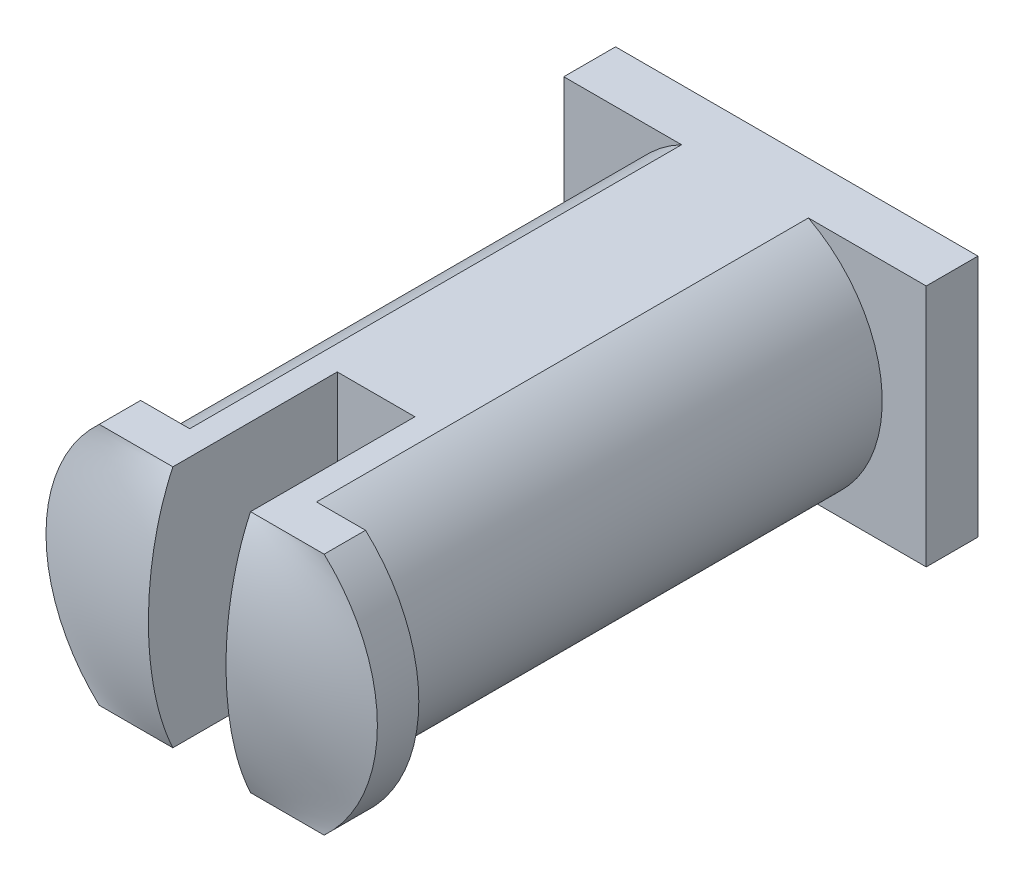
ISO-10303-21;
HEADER;
FILE_DESCRIPTION(('STEP AP214'),'2;1');
FILE_NAME('part.step','',(''),(''),'','','');
FILE_SCHEMA(('AUTOMOTIVE_DESIGN { 1 0 10303 214 1 1 1 1 }'));
ENDSEC;
DATA;
#1=APPLICATION_CONTEXT('core data for automotive mechanical design processes');
#2=APPLICATION_PROTOCOL_DEFINITION('international standard','automotive_design',2000,#1);
#3=PRODUCT_CONTEXT('',#1,'mechanical');
#4=PRODUCT('Part','Part','',(#3));
#5=PRODUCT_RELATED_PRODUCT_CATEGORY('part','',(#4));
#6=PRODUCT_DEFINITION_FORMATION('','',#4);
#7=PRODUCT_DEFINITION_CONTEXT('part definition',#1,'design');
#8=PRODUCT_DEFINITION('design','',#6,#7);
#9=PRODUCT_DEFINITION_SHAPE('','',#8);
#10=(LENGTH_UNIT() NAMED_UNIT(*) SI_UNIT(.MILLI.,.METRE.));
#11=(NAMED_UNIT(*) PLANE_ANGLE_UNIT() SI_UNIT($,.RADIAN.));
#12=(NAMED_UNIT(*) SI_UNIT($,.STERADIAN.) SOLID_ANGLE_UNIT());
#13=UNCERTAINTY_MEASURE_WITH_UNIT(LENGTH_MEASURE(1.E-05),#10,'distance_accuracy_value','');
#14=(GEOMETRIC_REPRESENTATION_CONTEXT(3) GLOBAL_UNCERTAINTY_ASSIGNED_CONTEXT((#13)) GLOBAL_UNIT_ASSIGNED_CONTEXT((#10,
#11,#12)) REPRESENTATION_CONTEXT('',''));
#15=CARTESIAN_POINT('',(0.,0.,0.));
#16=DIRECTION('',(0.,0.,1.));
#17=DIRECTION('',(1.,0.,0.));
#18=AXIS2_PLACEMENT_3D('',#15,#16,#17);
#19=CARTESIAN_POINT('',(-2.75841544187963,-2.9845,14.351));
#20=CARTESIAN_POINT('',(-0.919471813959878,-2.9845,14.351));
#21=CARTESIAN_POINT('',(0.919471813959876,-2.9845,14.351));
#22=CARTESIAN_POINT('',(2.75841544187963,-2.9845,14.351));
#23=CARTESIAN_POINT('',(-4.61780328789597,-1.2659661930324,14.351));
#24=CARTESIAN_POINT('',(-1.53926776263199,-1.2659661930324,15.5506106265129));
#25=CARTESIAN_POINT('',(1.53926776263199,-1.2659661930324,15.5506106265129));
#26=CARTESIAN_POINT('',(4.61780328789597,-1.2659661930324,14.351));
#27=CARTESIAN_POINT('',(-4.61780328789597,1.2659661930324,14.351));
#28=CARTESIAN_POINT('',(-1.53926776263199,1.2659661930324,15.5468752666751));
#29=CARTESIAN_POINT('',(1.53926776263199,1.2659661930324,15.5791275291301));
#30=CARTESIAN_POINT('',(4.61780328789597,1.2659661930324,14.351));
#31=CARTESIAN_POINT('',(-2.75841544187963,2.9845,14.351));
#32=CARTESIAN_POINT('',(-0.919471813959877,2.9845,14.351));
#33=CARTESIAN_POINT('',(0.919471813959877,2.9845,14.351));
#34=CARTESIAN_POINT('',(2.75841544187963,2.9845,14.351));
#35=(BOUNDED_SURFACE() B_SPLINE_SURFACE(3,3,((#19,#20,#21,#22),(#23,#24,#25,#26),(#27,#28,#29,
#30),(#31,#32,#33,#34)),.UNSPECIFIED.,.F.,.F.,.F.) B_SPLINE_SURFACE_WITH_KNOTS((4,4),(4,4),(0.,
1.),(0.,1.),.UNSPECIFIED.) GEOMETRIC_REPRESENTATION_ITEM() RATIONAL_B_SPLINE_SURFACE(((1.,1.,1.,
1.),(0.785829304770281,0.785829304770281,0.785829304770281,0.785829304770281),
(0.785829304770281,0.785829304770281,0.785829304770281,0.785829304770281),(1.,1.,1.,1.))) REPRESENTATION_ITEM('') SURFACE());
#36=DIRECTION('',(-1.,0.,0.));
#37=VECTOR('',#36,1.);
#38=CARTESIAN_POINT('',(-2.75841544187963,2.9845,14.351));
#39=LINE('',#38,#37);
#40=CARTESIAN_POINT('',(2.75841544187963,2.9845,14.351));
#41=VERTEX_POINT('',#40);
#42=CARTESIAN_POINT('',(0.9525,2.9845,14.351));
#43=VERTEX_POINT('',#42);
#44=EDGE_CURVE('E214',#41,#43,#39,.T.);
#45=CARTESIAN_POINT('',(0.9525,2.9845,14.351));
#46=CARTESIAN_POINT('',(0.9525,2.89639679395536,14.3922859415164));
#47=CARTESIAN_POINT('',(0.9525,2.80716008680234,14.4311139963097));
#48=CARTESIAN_POINT('',(0.9525,2.62690922869744,14.5039666566708));
#49=CARTESIAN_POINT('',(0.9525,2.53589812612907,14.5379987939517));
#50=CARTESIAN_POINT('',(0.9525,2.3523476412508,14.6014875861348));
#51=CARTESIAN_POINT('',(0.9525,2.2598089717893,14.6309463119983));
#52=CARTESIAN_POINT('',(0.9525,2.0732753749713,14.6856401946687));
#53=CARTESIAN_POINT('',(0.9525,1.97927768762511,14.7108658999848));
#54=CARTESIAN_POINT('',(0.9525,1.79024766304031,14.7572672013593));
#55=CARTESIAN_POINT('',(0.9525,1.69521489086051,14.7784410194967));
#56=CARTESIAN_POINT('',(0.9525,1.50435017689916,14.8169411729562));
#57=CARTESIAN_POINT('',(0.9525,1.40851800944559,14.8342663808417));
#58=CARTESIAN_POINT('',(0.952499999999999,1.15923089187968,14.8744254970377));
#59=CARTESIAN_POINT('',(0.9525,1.00531402271061,14.8944312291501));
#60=CARTESIAN_POINT('',(0.9525,0.696571738446862,14.9256146616373));
#61=CARTESIAN_POINT('',(0.9525,0.541746127972846,14.9367903878654));
#62=CARTESIAN_POINT('',(0.9525,0.23166990327333,14.9505928887469));
#63=CARTESIAN_POINT('',(0.9525,0.0764191774055433,14.9532171471547));
#64=CARTESIAN_POINT('',(0.9525,-0.233974941819646,14.949993518927));
#65=CARTESIAN_POINT('',(0.952499999999999,-0.389118346128311,14.9441466863906));
#66=CARTESIAN_POINT('',(0.952500000000001,-0.698801928554943,14.9238748420902));
#67=CARTESIAN_POINT('',(0.952500000000003,-0.85334226846948,14.9094523169607));
#68=CARTESIAN_POINT('',(0.952499999999997,-1.16129619955811,14.8717241962405));
#69=CARTESIAN_POINT('',(0.952499999999988,-1.31471015115525,14.8484215807522));
#70=CARTESIAN_POINT('',(0.952499999999989,-1.59791469544487,14.7964221225476));
#71=CARTESIAN_POINT('',(0.952499999999997,-1.72793575202501,14.7689794117324));
#72=CARTESIAN_POINT('',(0.952500000000003,-1.98619255256503,14.7067140464462));
#73=CARTESIAN_POINT('',(0.952500000000001,-2.11442866894973,14.6718929568263));
#74=CARTESIAN_POINT('',(0.9525,-2.32591473498404,14.607294144606));
#75=CARTESIAN_POINT('',(0.9525,-2.40984585068346,14.5797337533182));
#76=CARTESIAN_POINT('',(0.9525,-2.57643570532112,14.5208933616152));
#77=CARTESIAN_POINT('',(0.9525,-2.65909396325007,14.4896119922114));
#78=CARTESIAN_POINT('',(0.9525,-2.82296684993933,14.4232071818526));
#79=CARTESIAN_POINT('',(0.952499999999999,-2.90417962228176,14.3880791639081));
#80=CARTESIAN_POINT('',(0.952499999999998,-2.9845,14.351));
#81=B_SPLINE_CURVE_WITH_KNOTS('',3,(#45,#46,#47,#48,#49,#50,#51,#52,#53,#54,#55,#56,#57,#58,#59,
#60,#61,#62,#63,#64,#65,#66,#67,#68,#69,#70,#71,#72,#73,#74,#75,#76,#77,#78,#79,#80),
.UNSPECIFIED.,.F.,.F.,(4,2,2,2,2,2,2,2,2,2,2,2,2,2,2,2,2,4),(0.,0.29182945372805,
0.583195373160211,0.874428967151296,1.16630441626286,1.4583076447358,1.75039630204355,
2.21574098255921,2.68118967194621,3.1467753059626,3.61230300987704,4.07769579371437,
4.54293253200652,4.94139982741323,5.33978269791094,5.60472773292016,5.8697705473642,
6.13513222577563),.UNSPECIFIED.);
#82=CARTESIAN_POINT('',(0.9525,-2.9845,14.351));
#83=VERTEX_POINT('',#82);
#84=EDGE_CURVE('E11',#43,#83,#81,.T.);
#85=DIRECTION('',(1.,0.,0.));
#86=VECTOR('',#85,1.);
#87=CARTESIAN_POINT('',(-2.75841544187963,-2.9845,14.351));
#88=LINE('',#87,#86);
#89=CARTESIAN_POINT('',(2.75841544187963,-2.9845,14.351));
#90=VERTEX_POINT('',#89);
#91=EDGE_CURVE('E212',#83,#90,#88,.T.);
#92=CARTESIAN_POINT('',(0.,0.,14.351));
#93=DIRECTION('',(0.,0.,1.));
#94=DIRECTION('',(-1.,0.,0.));
#95=AXIS2_PLACEMENT_3D('',#92,#93,#94);
#96=CIRCLE('',#95,4.064);
#97=EDGE_CURVE('E219',#90,#41,#96,.T.);
#98=ORIENTED_EDGE('',*,*,#44,.T.);
#99=ORIENTED_EDGE('',*,*,#84,.T.);
#100=ORIENTED_EDGE('',*,*,#91,.T.);
#101=ORIENTED_EDGE('',*,*,#97,.T.);
#102=EDGE_LOOP('',(#98,#99,#100,#101));
#103=FACE_BOUND('',#102,.T.);
#104=ADVANCED_FACE('F38',(#103),#35,.F.);
#105=CARTESIAN_POINT('',(0.,0.,1.27));
#106=DIRECTION('',(0.,0.,1.));
#107=DIRECTION('',(1.,0.,0.));
#108=AXIS2_PLACEMENT_3D('',#105,#106,#107);
#109=PLANE('',#108);
#110=CARTESIAN_POINT('',(0.,0.,1.27));
#111=DIRECTION('',(0.,0.,1.));
#112=DIRECTION('',(1.,0.,0.));
#113=AXIS2_PLACEMENT_3D('',#110,#111,#112);
#114=CIRCLE('',#113,3.3655);
#115=CARTESIAN_POINT('',(-1.55542598666732,2.9845,1.27));
#116=VERTEX_POINT('',#115);
#117=CARTESIAN_POINT('',(-1.55542598666732,-2.9845,1.27));
#118=VERTEX_POINT('',#117);
#119=EDGE_CURVE('E146',#116,#118,#114,.T.);
#120=ORIENTED_EDGE('',*,*,#119,.F.);
#121=DIRECTION('',(-1.,0.,0.));
#122=VECTOR('',#121,1.);
#123=CARTESIAN_POINT('',(-4.445,2.9845,1.27));
#124=LINE('',#123,#122);
#125=CARTESIAN_POINT('',(-4.445,2.9845,1.27));
#126=VERTEX_POINT('',#125);
#127=EDGE_CURVE('E149',#116,#126,#124,.T.);
#128=ORIENTED_EDGE('',*,*,#127,.T.);
#129=DIRECTION('',(0.,-1.,0.));
#130=VECTOR('',#129,1.);
#131=CARTESIAN_POINT('',(-4.445,2.9845,1.27));
#132=LINE('',#131,#130);
#133=CARTESIAN_POINT('',(-4.445,-2.9845,1.27));
#134=VERTEX_POINT('',#133);
#135=EDGE_CURVE('E189',#126,#134,#132,.T.);
#136=ORIENTED_EDGE('',*,*,#135,.T.);
#137=DIRECTION('',(1.,0.,0.));
#138=VECTOR('',#137,1.);
#139=CARTESIAN_POINT('',(-4.445,-2.9845,1.27));
#140=LINE('',#139,#138);
#141=EDGE_CURVE('E152',#134,#118,#140,.T.);
#142=ORIENTED_EDGE('',*,*,#141,.T.);
#143=EDGE_LOOP('',(#120,#128,#136,#142));
#144=FACE_BOUND('',#143,.T.);
#145=ADVANCED_FACE('F148',(#144),#109,.T.);
#146=CARTESIAN_POINT('',(4.445,2.9845,1.27));
#147=DIRECTION('',(-1.,0.,0.));
#148=DIRECTION('',(0.,0.,1.));
#149=AXIS2_PLACEMENT_3D('',#146,#147,#148);
#150=PLANE('',#149);
#151=DIRECTION('',(0.,1.,0.));
#152=VECTOR('',#151,1.);
#153=CARTESIAN_POINT('',(4.445,2.9845,0.));
#154=LINE('',#153,#152);
#155=CARTESIAN_POINT('',(4.445,-2.9845,0.));
#156=VERTEX_POINT('',#155);
#157=CARTESIAN_POINT('',(4.445,2.9845,0.));
#158=VERTEX_POINT('',#157);
#159=EDGE_CURVE('E185',#156,#158,#154,.T.);
#160=ORIENTED_EDGE('',*,*,#159,.T.);
#161=DIRECTION('',(0.,0.,-1.));
#162=VECTOR('',#161,1.);
#163=CARTESIAN_POINT('',(4.445,2.9845,1.27));
#164=LINE('',#163,#162);
#165=CARTESIAN_POINT('',(4.445,2.9845,1.27));
#166=VERTEX_POINT('',#165);
#167=EDGE_CURVE('E207',#166,#158,#164,.T.);
#168=ORIENTED_EDGE('',*,*,#167,.F.);
#169=DIRECTION('',(0.,1.,0.));
#170=VECTOR('',#169,1.);
#171=CARTESIAN_POINT('',(4.445,2.9845,1.27));
#172=LINE('',#171,#170);
#173=CARTESIAN_POINT('',(4.445,-2.9845,1.27));
#174=VERTEX_POINT('',#173);
#175=EDGE_CURVE('E166',#174,#166,#172,.T.);
#176=ORIENTED_EDGE('',*,*,#175,.F.);
#177=DIRECTION('',(0.,0.,-1.));
#178=VECTOR('',#177,1.);
#179=CARTESIAN_POINT('',(4.445,-2.9845,1.27));
#180=LINE('',#179,#178);
#181=EDGE_CURVE('E193',#174,#156,#180,.T.);
#182=ORIENTED_EDGE('',*,*,#181,.T.);
#183=EDGE_LOOP('',(#160,#168,#176,#182));
#184=FACE_BOUND('',#183,.T.);
#185=ADVANCED_FACE('F272',(#184),#150,.F.);
#186=CARTESIAN_POINT('',(-4.445,2.9845,1.27));
#187=DIRECTION('',(0.,-1.,0.));
#188=DIRECTION('',(0.,0.,-1.));
#189=AXIS2_PLACEMENT_3D('',#186,#187,#188);
#190=PLANE('',#189);
#191=DIRECTION('',(-1.,0.,0.));
#192=VECTOR('',#191,1.);
#193=CARTESIAN_POINT('',(-0.9525,2.9845,10.31875));
#194=LINE('',#193,#192);
#195=CARTESIAN_POINT('',(0.9525,2.9845,10.31875));
#196=VERTEX_POINT('',#195);
#197=CARTESIAN_POINT('',(-0.9525,2.9845,10.31875));
#198=VERTEX_POINT('',#197);
#199=EDGE_CURVE('E350',#196,#198,#194,.T.);
#200=ORIENTED_EDGE('',*,*,#199,.F.);
#201=DIRECTION('',(0.,0.,-1.));
#202=VECTOR('',#201,1.);
#203=CARTESIAN_POINT('',(0.9525,2.9845,10.31875));
#204=LINE('',#203,#202);
#205=EDGE_CURVE('E335',#43,#196,#204,.T.);
#206=ORIENTED_EDGE('',*,*,#205,.F.);
#207=ORIENTED_EDGE('',*,*,#44,.F.);
#208=DIRECTION('',(0.,0.,-1.));
#209=VECTOR('',#208,1.);
#210=CARTESIAN_POINT('',(2.75841544187963,2.9845,14.351));
#211=LINE('',#210,#209);
#212=CARTESIAN_POINT('',(2.75841544187963,2.9845,13.335));
#213=VERTEX_POINT('',#212);
#214=EDGE_CURVE('E319',#41,#213,#211,.T.);
#215=ORIENTED_EDGE('',*,*,#214,.T.);
#216=DIRECTION('',(-1.,0.,0.));
#217=VECTOR('',#216,1.);
#218=CARTESIAN_POINT('',(-2.75841544187963,2.9845,13.335));
#219=LINE('',#218,#217);
#220=CARTESIAN_POINT('',(1.55542598666732,2.9845,13.335));
#221=VERTEX_POINT('',#220);
#222=EDGE_CURVE('E213',#213,#221,#219,.T.);
#223=ORIENTED_EDGE('',*,*,#222,.T.);
#224=DIRECTION('',(0.,0.,-1.));
#225=VECTOR('',#224,1.);
#226=CARTESIAN_POINT('',(1.55542598666732,2.9845,13.335));
#227=LINE('',#226,#225);
#228=CARTESIAN_POINT('',(1.55542598666732,2.9845,1.27));
#229=VERTEX_POINT('',#228);
#230=EDGE_CURVE('E171',#221,#229,#227,.T.);
#231=ORIENTED_EDGE('',*,*,#230,.T.);
#232=EDGE_CURVE('E165',#166,#229,#124,.T.);
#233=ORIENTED_EDGE('',*,*,#232,.F.);
#234=ORIENTED_EDGE('',*,*,#167,.T.);
#235=DIRECTION('',(-1.,0.,0.));
#236=VECTOR('',#235,1.);
#237=CARTESIAN_POINT('',(-4.445,2.9845,0.));
#238=LINE('',#237,#236);
#239=CARTESIAN_POINT('',(-4.445,2.9845,0.));
#240=VERTEX_POINT('',#239);
#241=EDGE_CURVE('E196',#158,#240,#238,.T.);
#242=ORIENTED_EDGE('',*,*,#241,.T.);
#243=DIRECTION('',(0.,0.,-1.));
#244=VECTOR('',#243,1.);
#245=CARTESIAN_POINT('',(-4.445,2.9845,1.27));
#246=LINE('',#245,#244);
#247=EDGE_CURVE('E163',#126,#240,#246,.T.);
#248=ORIENTED_EDGE('',*,*,#247,.F.);
#249=ORIENTED_EDGE('',*,*,#127,.F.);
#250=DIRECTION('',(0.,0.,-1.));
#251=VECTOR('',#250,1.);
#252=CARTESIAN_POINT('',(-1.55542598666732,2.9845,13.335));
#253=LINE('',#252,#251);
#254=CARTESIAN_POINT('',(-1.55542598666732,2.9845,13.335));
#255=VERTEX_POINT('',#254);
#256=EDGE_CURVE('E160',#255,#116,#253,.T.);
#257=ORIENTED_EDGE('',*,*,#256,.F.);
#258=CARTESIAN_POINT('',(-2.75841544187963,2.9845,13.335));
#259=VERTEX_POINT('',#258);
#260=EDGE_CURVE('E102',#255,#259,#219,.T.);
#261=ORIENTED_EDGE('',*,*,#260,.T.);
#262=DIRECTION('',(0.,0.,-1.));
#263=VECTOR('',#262,1.);
#264=CARTESIAN_POINT('',(-2.75841544187963,2.9845,14.351));
#265=LINE('',#264,#263);
#266=CARTESIAN_POINT('',(-2.75841544187963,2.9845,14.351));
#267=VERTEX_POINT('',#266);
#268=EDGE_CURVE('E217',#267,#259,#265,.T.);
#269=ORIENTED_EDGE('',*,*,#268,.F.);
#270=CARTESIAN_POINT('',(-0.952499999999999,2.9845,14.351));
#271=VERTEX_POINT('',#270);
#272=EDGE_CURVE('E218',#271,#267,#39,.T.);
#273=ORIENTED_EDGE('',*,*,#272,.F.);
#274=DIRECTION('',(0.,0.,1.));
#275=VECTOR('',#274,1.);
#276=CARTESIAN_POINT('',(-0.9525,2.9845,10.31875));
#277=LINE('',#276,#275);
#278=EDGE_CURVE('E61',#198,#271,#277,.T.);
#279=ORIENTED_EDGE('',*,*,#278,.F.);
#280=EDGE_LOOP('',(#200,#206,#207,#215,#223,#231,#233,#234,#242,#248,#249,#257,#261,#269,#273,#279));
#281=FACE_BOUND('',#280,.T.);
#282=ADVANCED_FACE('F159',(#281),#190,.F.);
#283=CARTESIAN_POINT('',(-4.445,2.9845,1.27));
#284=DIRECTION('',(1.,0.,0.));
#285=DIRECTION('',(0.,0.,-1.));
#286=AXIS2_PLACEMENT_3D('',#283,#284,#285);
#287=PLANE('',#286);
#288=DIRECTION('',(0.,-1.,0.));
#289=VECTOR('',#288,1.);
#290=CARTESIAN_POINT('',(-4.445,2.9845,0.));
#291=LINE('',#290,#289);
#292=CARTESIAN_POINT('',(-4.445,-2.9845,0.));
#293=VERTEX_POINT('',#292);
#294=EDGE_CURVE('E198',#240,#293,#291,.T.);
#295=ORIENTED_EDGE('',*,*,#294,.T.);
#296=DIRECTION('',(0.,0.,-1.));
#297=VECTOR('',#296,1.);
#298=CARTESIAN_POINT('',(-4.445,-2.9845,1.27));
#299=LINE('',#298,#297);
#300=EDGE_CURVE('E203',#134,#293,#299,.T.);
#301=ORIENTED_EDGE('',*,*,#300,.F.);
#302=ORIENTED_EDGE('',*,*,#135,.F.);
#303=ORIENTED_EDGE('',*,*,#247,.T.);
#304=EDGE_LOOP('',(#295,#301,#302,#303));
#305=FACE_BOUND('',#304,.T.);
#306=ADVANCED_FACE('F267',(#305),#287,.F.);
#307=CARTESIAN_POINT('',(-4.445,-2.9845,1.27));
#308=DIRECTION('',(0.,1.,0.));
#309=DIRECTION('',(0.,0.,1.));
#310=AXIS2_PLACEMENT_3D('',#307,#308,#309);
#311=PLANE('',#310);
#312=ORIENTED_EDGE('',*,*,#91,.F.);
#313=DIRECTION('',(0.,0.,1.));
#314=VECTOR('',#313,1.);
#315=CARTESIAN_POINT('',(0.9525,-2.9845,10.31875));
#316=LINE('',#315,#314);
#317=CARTESIAN_POINT('',(0.9525,-2.9845,10.31875));
#318=VERTEX_POINT('',#317);
#319=EDGE_CURVE('E338',#318,#83,#316,.T.);
#320=ORIENTED_EDGE('',*,*,#319,.F.);
#321=DIRECTION('',(1.,0.,0.));
#322=VECTOR('',#321,1.);
#323=CARTESIAN_POINT('',(-0.9525,-2.9845,10.31875));
#324=LINE('',#323,#322);
#325=CARTESIAN_POINT('',(-0.9525,-2.9845,10.31875));
#326=VERTEX_POINT('',#325);
#327=EDGE_CURVE('E341',#326,#318,#324,.T.);
#328=ORIENTED_EDGE('',*,*,#327,.F.);
#329=DIRECTION('',(0.,0.,-1.));
#330=VECTOR('',#329,1.);
#331=CARTESIAN_POINT('',(-0.9525,-2.9845,10.31875));
#332=LINE('',#331,#330);
#333=CARTESIAN_POINT('',(-0.9525,-2.9845,14.351));
#334=VERTEX_POINT('',#333);
#335=EDGE_CURVE('E343',#334,#326,#332,.T.);
#336=ORIENTED_EDGE('',*,*,#335,.F.);
#337=CARTESIAN_POINT('',(-2.75841544187963,-2.9845,14.351));
#338=VERTEX_POINT('',#337);
#339=EDGE_CURVE('E93',#338,#334,#88,.T.);
#340=ORIENTED_EDGE('',*,*,#339,.F.);
#341=DIRECTION('',(0.,0.,-1.));
#342=VECTOR('',#341,1.);
#343=CARTESIAN_POINT('',(-2.75841544187963,-2.9845,14.351));
#344=LINE('',#343,#342);
#345=CARTESIAN_POINT('',(-2.75841544187963,-2.9845,13.335));
#346=VERTEX_POINT('',#345);
#347=EDGE_CURVE('E156',#338,#346,#344,.T.);
#348=ORIENTED_EDGE('',*,*,#347,.T.);
#349=DIRECTION('',(1.,0.,0.));
#350=VECTOR('',#349,1.);
#351=CARTESIAN_POINT('',(-2.75841544187963,-2.9845,13.335));
#352=LINE('',#351,#350);
#353=CARTESIAN_POINT('',(-1.55542598666732,-2.9845,13.335));
#354=VERTEX_POINT('',#353);
#355=EDGE_CURVE('E313',#346,#354,#352,.T.);
#356=ORIENTED_EDGE('',*,*,#355,.T.);
#357=DIRECTION('',(0.,0.,-1.));
#358=VECTOR('',#357,1.);
#359=CARTESIAN_POINT('',(-1.55542598666732,-2.9845,13.335));
#360=LINE('',#359,#358);
#361=EDGE_CURVE('E183',#354,#118,#360,.T.);
#362=ORIENTED_EDGE('',*,*,#361,.T.);
#363=ORIENTED_EDGE('',*,*,#141,.F.);
#364=ORIENTED_EDGE('',*,*,#300,.T.);
#365=DIRECTION('',(1.,0.,0.));
#366=VECTOR('',#365,1.);
#367=CARTESIAN_POINT('',(-4.445,-2.9845,0.));
#368=LINE('',#367,#366);
#369=EDGE_CURVE('E187',#293,#156,#368,.T.);
#370=ORIENTED_EDGE('',*,*,#369,.T.);
#371=ORIENTED_EDGE('',*,*,#181,.F.);
#372=CARTESIAN_POINT('',(1.55542598666732,-2.9845,1.27));
#373=VERTEX_POINT('',#372);
#374=EDGE_CURVE('E191',#373,#174,#140,.T.);
#375=ORIENTED_EDGE('',*,*,#374,.F.);
#376=DIRECTION('',(0.,0.,-1.));
#377=VECTOR('',#376,1.);
#378=CARTESIAN_POINT('',(1.55542598666732,-2.9845,13.335));
#379=LINE('',#378,#377);
#380=CARTESIAN_POINT('',(1.55542598666732,-2.9845,13.335));
#381=VERTEX_POINT('',#380);
#382=EDGE_CURVE('E175',#381,#373,#379,.T.);
#383=ORIENTED_EDGE('',*,*,#382,.F.);
#384=CARTESIAN_POINT('',(2.75841544187963,-2.9845,13.335));
#385=VERTEX_POINT('',#384);
#386=EDGE_CURVE('E306',#381,#385,#352,.T.);
#387=ORIENTED_EDGE('',*,*,#386,.T.);
#388=DIRECTION('',(0.,0.,-1.));
#389=VECTOR('',#388,1.);
#390=CARTESIAN_POINT('',(2.75841544187963,-2.9845,14.351));
#391=LINE('',#390,#389);
#392=EDGE_CURVE('E309',#90,#385,#391,.T.);
#393=ORIENTED_EDGE('',*,*,#392,.F.);
#394=EDGE_LOOP('',(#312,#320,#328,#336,#340,#348,#356,#362,#363,#364,#370,#371,#375,#383,#387,#393));
#395=FACE_BOUND('',#394,.T.);
#396=ADVANCED_FACE('F261',(#395),#311,.F.);
#397=CARTESIAN_POINT('',(0.,0.,1.27));
#398=DIRECTION('',(0.,0.,1.));
#399=DIRECTION('',(1.,0.,0.));
#400=AXIS2_PLACEMENT_3D('',#397,#398,#399);
#401=CIRCLE('',#400,3.3655);
#402=EDGE_CURVE('E70',#373,#229,#401,.T.);
#403=ORIENTED_EDGE('',*,*,#402,.F.);
#404=ORIENTED_EDGE('',*,*,#374,.T.);
#405=ORIENTED_EDGE('',*,*,#175,.T.);
#406=ORIENTED_EDGE('',*,*,#232,.T.);
#407=EDGE_LOOP('',(#403,#404,#405,#406));
#408=FACE_BOUND('',#407,.T.);
#409=ADVANCED_FACE('F258',(#408),#109,.T.);
#410=CARTESIAN_POINT('',(0.,0.,0.));
#411=DIRECTION('',(0.,0.,1.));
#412=DIRECTION('',(1.,0.,0.));
#413=AXIS2_PLACEMENT_3D('',#410,#411,#412);
#414=PLANE('',#413);
#415=ORIENTED_EDGE('',*,*,#159,.F.);
#416=ORIENTED_EDGE('',*,*,#369,.F.);
#417=ORIENTED_EDGE('',*,*,#294,.F.);
#418=ORIENTED_EDGE('',*,*,#241,.F.);
#419=EDGE_LOOP('',(#415,#416,#417,#418));
#420=FACE_BOUND('',#419,.T.);
#421=ADVANCED_FACE('F257',(#420),#414,.F.);
#422=CARTESIAN_POINT('',(0.,0.,13.335));
#423=DIRECTION('',(0.,0.,-1.));
#424=DIRECTION('',(-1.,0.,0.));
#425=AXIS2_PLACEMENT_3D('',#422,#423,#424);
#426=CYLINDRICAL_SURFACE('',#425,3.3655);
#427=ORIENTED_EDGE('',*,*,#119,.T.);
#428=ORIENTED_EDGE('',*,*,#361,.F.);
#429=CARTESIAN_POINT('',(0.,0.,13.335));
#430=DIRECTION('',(0.,0.,1.));
#431=DIRECTION('',(1.,0.,0.));
#432=AXIS2_PLACEMENT_3D('',#429,#430,#431);
#433=CIRCLE('',#432,3.3655);
#434=EDGE_CURVE('E170',#255,#354,#433,.T.);
#435=ORIENTED_EDGE('',*,*,#434,.F.);
#436=ORIENTED_EDGE('',*,*,#256,.T.);
#437=EDGE_LOOP('',(#427,#428,#435,#436));
#438=FACE_BOUND('',#437,.T.);
#439=ADVANCED_FACE('F168',(#438),#426,.T.);
#440=CARTESIAN_POINT('',(0.,0.,13.335));
#441=DIRECTION('',(0.,0.,-1.));
#442=DIRECTION('',(-1.,0.,0.));
#443=AXIS2_PLACEMENT_3D('',#440,#441,#442);
#444=CYLINDRICAL_SURFACE('',#443,3.3655);
#445=ORIENTED_EDGE('',*,*,#402,.T.);
#446=ORIENTED_EDGE('',*,*,#230,.F.);
#447=CARTESIAN_POINT('',(0.,0.,13.335));
#448=DIRECTION('',(0.,0.,1.));
#449=DIRECTION('',(1.,0.,0.));
#450=AXIS2_PLACEMENT_3D('',#447,#448,#449);
#451=CIRCLE('',#450,3.3655);
#452=EDGE_CURVE('E172',#381,#221,#451,.T.);
#453=ORIENTED_EDGE('',*,*,#452,.F.);
#454=ORIENTED_EDGE('',*,*,#382,.T.);
#455=EDGE_LOOP('',(#445,#446,#453,#454));
#456=FACE_BOUND('',#455,.T.);
#457=ADVANCED_FACE('F251',(#456),#444,.T.);
#458=CARTESIAN_POINT('',(0.,0.,13.335));
#459=DIRECTION('',(0.,0.,-1.));
#460=DIRECTION('',(-1.,0.,0.));
#461=AXIS2_PLACEMENT_3D('',#458,#459,#460);
#462=PLANE('',#461);
#463=ORIENTED_EDGE('',*,*,#260,.F.);
#464=ORIENTED_EDGE('',*,*,#434,.T.);
#465=ORIENTED_EDGE('',*,*,#355,.F.);
#466=CARTESIAN_POINT('',(0.,0.,13.335));
#467=DIRECTION('',(0.,0.,1.));
#468=DIRECTION('',(-1.,0.,0.));
#469=AXIS2_PLACEMENT_3D('',#466,#467,#468);
#470=CIRCLE('',#469,4.064);
#471=EDGE_CURVE('E314',#259,#346,#470,.T.);
#472=ORIENTED_EDGE('',*,*,#471,.F.);
#473=EDGE_LOOP('',(#463,#464,#465,#472));
#474=FACE_BOUND('',#473,.T.);
#475=ADVANCED_FACE('F242',(#474),#462,.T.);
#476=CARTESIAN_POINT('',(0.,0.,14.351));
#477=DIRECTION('',(0.,0.,-1.));
#478=DIRECTION('',(-1.,0.,0.));
#479=AXIS2_PLACEMENT_3D('',#476,#477,#478);
#480=CYLINDRICAL_SURFACE('',#479,4.064);
#481=ORIENTED_EDGE('',*,*,#471,.T.);
#482=ORIENTED_EDGE('',*,*,#347,.F.);
#483=CARTESIAN_POINT('',(0.,0.,14.351));
#484=DIRECTION('',(0.,0.,1.));
#485=DIRECTION('',(-1.,0.,0.));
#486=AXIS2_PLACEMENT_3D('',#483,#484,#485);
#487=CIRCLE('',#486,4.064);
#488=EDGE_CURVE('E210',#267,#338,#487,.T.);
#489=ORIENTED_EDGE('',*,*,#488,.F.);
#490=ORIENTED_EDGE('',*,*,#268,.T.);
#491=EDGE_LOOP('',(#481,#482,#489,#490));
#492=FACE_BOUND('',#491,.T.);
#493=ADVANCED_FACE('F246',(#492),#480,.T.);
#494=CARTESIAN_POINT('',(0.,0.,14.351));
#495=DIRECTION('',(0.,0.,-1.));
#496=DIRECTION('',(-1.,0.,0.));
#497=AXIS2_PLACEMENT_3D('',#494,#495,#496);
#498=CYLINDRICAL_SURFACE('',#497,4.064);
#499=CARTESIAN_POINT('',(0.,0.,13.335));
#500=DIRECTION('',(0.,0.,1.));
#501=DIRECTION('',(-1.,0.,0.));
#502=AXIS2_PLACEMENT_3D('',#499,#500,#501);
#503=CIRCLE('',#502,4.064);
#504=EDGE_CURVE('E317',#385,#213,#503,.T.);
#505=ORIENTED_EDGE('',*,*,#504,.T.);
#506=ORIENTED_EDGE('',*,*,#214,.F.);
#507=ORIENTED_EDGE('',*,*,#97,.F.);
#508=ORIENTED_EDGE('',*,*,#392,.T.);
#509=EDGE_LOOP('',(#505,#506,#507,#508));
#510=FACE_BOUND('',#509,.T.);
#511=ADVANCED_FACE('F243',(#510),#498,.T.);
#512=CARTESIAN_POINT('',(-0.9525,-2.9845,14.351));
#513=CARTESIAN_POINT('',(-0.9525,-2.89457865187292,14.3925199830118));
#514=CARTESIAN_POINT('',(-0.9525,-2.80353088462356,14.4315626089535));
#515=CARTESIAN_POINT('',(-0.9525,-2.61966491151637,14.5048013430267));
#516=CARTESIAN_POINT('',(-0.9525,-2.52684961860236,14.5390047542583));
#517=CARTESIAN_POINT('',(-0.9525,-2.33969537427707,14.6027850129935));
#518=CARTESIAN_POINT('',(-0.9525,-2.24535710540702,14.6323638728451));
#519=CARTESIAN_POINT('',(-0.9525,-2.05514155498668,14.6872695466352));
#520=CARTESIAN_POINT('',(-0.9525,-1.95926042960282,14.7125829901317));
#521=CARTESIAN_POINT('',(-0.9525,-1.76646586029005,14.7590960455252));
#522=CARTESIAN_POINT('',(-0.9525,-1.66955199689774,14.7802939129656));
#523=CARTESIAN_POINT('',(-0.9525,-1.47492729342095,14.8187742451312));
#524=CARTESIAN_POINT('',(-0.952499999999999,-1.37721623471474,14.8360555956586));
#525=CARTESIAN_POINT('',(-0.952499999999999,-1.12514340849552,14.8756775259948));
#526=CARTESIAN_POINT('',(-0.9525,-0.970341875144311,14.8952591525857));
#527=CARTESIAN_POINT('',(-0.9525,-0.659860726674006,14.9256087962077));
#528=CARTESIAN_POINT('',(-0.9525,-0.504180932329514,14.9363749435535));
#529=CARTESIAN_POINT('',(-0.9525,-0.19241613528964,14.9493249302331));
#530=CARTESIAN_POINT('',(-0.9525,-0.0363310220514419,14.9515061111031));
#531=CARTESIAN_POINT('',(-0.9525,0.275600983456696,14.9473158902372));
#532=CARTESIAN_POINT('',(-0.952499999999999,0.431447966593401,14.9409511281567));
#533=CARTESIAN_POINT('',(-0.952500000000001,0.742511699341223,14.9195202975997));
#534=CARTESIAN_POINT('',(-0.952500000000003,0.897728623123027,14.9044568259331));
#535=CARTESIAN_POINT('',(-0.952499999999996,1.20692700420448,14.8652721482652));
#536=CARTESIAN_POINT('',(-0.952499999999987,1.36090891256467,14.841154418829));
#537=CARTESIAN_POINT('',(-0.952499999999981,1.76721364295355,14.7643420814864));
#538=CARTESIAN_POINT('',(-0.952499999999997,2.0180919088999,14.7032708428757));
#539=CARTESIAN_POINT('',(-0.952500000000001,2.34602935633918,14.6016797928753));
#540=CARTESIAN_POINT('',(-0.9525,2.42738889131763,14.5746311883608));
#541=CARTESIAN_POINT('',(-0.9525,2.58888100288673,14.5169680268545));
#542=CARTESIAN_POINT('',(-0.9525,2.66901311918022,14.486352167433));
#543=CARTESIAN_POINT('',(-0.9525,2.82788457829611,14.421447209968));
#544=CARTESIAN_POINT('',(-0.9525,2.90662216860711,14.3871538259088));
#545=CARTESIAN_POINT('',(-0.952499999999999,2.9845,14.351));
#546=B_SPLINE_CURVE_WITH_KNOTS('',3,(#512,#513,#514,#515,#516,#517,#518,#519,#520,#521,#522,
#523,#524,#525,#526,#527,#528,#529,#530,#531,#532,#533,#534,#535,#536,#537,#538,#539,#540,#541,
#542,#543,#544,#545),.UNSPECIFIED.,.F.,.F.,(4,2,2,2,2,2,2,2,2,2,2,2,2,2,2,2,4),(0.,
0.297072441159476,0.593691660907471,0.890181447034702,1.18758399000437,1.48511231817215,
1.78272518329969,2.25054531204926,2.71846463563318,3.18652884606431,3.65422961065391,
4.12179082550789,4.58917269409591,5.36176356963299,5.61892110765141,5.87617283164823,
6.13372770002896),.UNSPECIFIED.);
#547=EDGE_CURVE('E54',#334,#271,#546,.T.);
#548=ORIENTED_EDGE('',*,*,#339,.T.);
#549=ORIENTED_EDGE('',*,*,#547,.T.);
#550=ORIENTED_EDGE('',*,*,#272,.T.);
#551=ORIENTED_EDGE('',*,*,#488,.T.);
#552=EDGE_LOOP('',(#548,#549,#550,#551));
#553=FACE_BOUND('',#552,.T.);
#554=ADVANCED_FACE('F40',(#553),#35,.F.);
#555=ORIENTED_EDGE('',*,*,#386,.F.);
#556=ORIENTED_EDGE('',*,*,#452,.T.);
#557=ORIENTED_EDGE('',*,*,#222,.F.);
#558=ORIENTED_EDGE('',*,*,#504,.F.);
#559=EDGE_LOOP('',(#555,#556,#557,#558));
#560=FACE_BOUND('',#559,.T.);
#561=ADVANCED_FACE('F237',(#560),#462,.T.);
#562=CARTESIAN_POINT('',(0.9525,-8.02556539745287,10.31875));
#563=DIRECTION('',(1.,0.,0.));
#564=DIRECTION('',(0.,0.,-1.));
#565=AXIS2_PLACEMENT_3D('',#562,#563,#564);
#566=PLANE('',#565);
#567=ORIENTED_EDGE('',*,*,#205,.T.);
#568=DIRECTION('',(0.,1.,0.));
#569=VECTOR('',#568,1.);
#570=CARTESIAN_POINT('',(0.9525,-8.02556539745287,10.31875));
#571=LINE('',#570,#569);
#572=EDGE_CURVE('E354',#318,#196,#571,.T.);
#573=ORIENTED_EDGE('',*,*,#572,.F.);
#574=ORIENTED_EDGE('',*,*,#319,.T.);
#575=ORIENTED_EDGE('',*,*,#84,.F.);
#576=EDGE_LOOP('',(#567,#573,#574,#575));
#577=FACE_BOUND('',#576,.T.);
#578=ADVANCED_FACE('F231',(#577),#566,.F.);
#579=CARTESIAN_POINT('',(-0.9525,-8.02556539745287,10.31875));
#580=DIRECTION('',(-1.,0.,0.));
#581=DIRECTION('',(0.,0.,1.));
#582=AXIS2_PLACEMENT_3D('',#579,#580,#581);
#583=PLANE('',#582);
#584=ORIENTED_EDGE('',*,*,#335,.T.);
#585=DIRECTION('',(0.,1.,0.));
#586=VECTOR('',#585,1.);
#587=CARTESIAN_POINT('',(-0.9525,-8.02556539745287,10.31875));
#588=LINE('',#587,#586);
#589=EDGE_CURVE('E346',#326,#198,#588,.T.);
#590=ORIENTED_EDGE('',*,*,#589,.T.);
#591=ORIENTED_EDGE('',*,*,#278,.T.);
#592=ORIENTED_EDGE('',*,*,#547,.F.);
#593=EDGE_LOOP('',(#584,#590,#591,#592));
#594=FACE_BOUND('',#593,.T.);
#595=ADVANCED_FACE('F226',(#594),#583,.F.);
#596=CARTESIAN_POINT('',(-0.9525,-8.02556539745287,10.31875));
#597=DIRECTION('',(0.,0.,-1.));
#598=DIRECTION('',(-1.,0.,0.));
#599=AXIS2_PLACEMENT_3D('',#596,#597,#598);
#600=PLANE('',#599);
#601=ORIENTED_EDGE('',*,*,#327,.T.);
#602=ORIENTED_EDGE('',*,*,#572,.T.);
#603=ORIENTED_EDGE('',*,*,#199,.T.);
#604=ORIENTED_EDGE('',*,*,#589,.F.);
#605=EDGE_LOOP('',(#601,#602,#603,#604));
#606=FACE_BOUND('',#605,.T.);
#607=ADVANCED_FACE('F230',(#606),#600,.F.);
#608=CLOSED_SHELL('',(#104,#145,#185,#282,#306,#396,#409,#421,#439,#457,#475,#493,#511,#554,
#561,#578,#595,#607));
#609=MANIFOLD_SOLID_BREP('B2',#608);
#610=ADVANCED_BREP_SHAPE_REPRESENTATION('',(#18,#609),#14);
#611=SHAPE_DEFINITION_REPRESENTATION(#9,#610);
ENDSEC;
END-ISO-10303-21;
